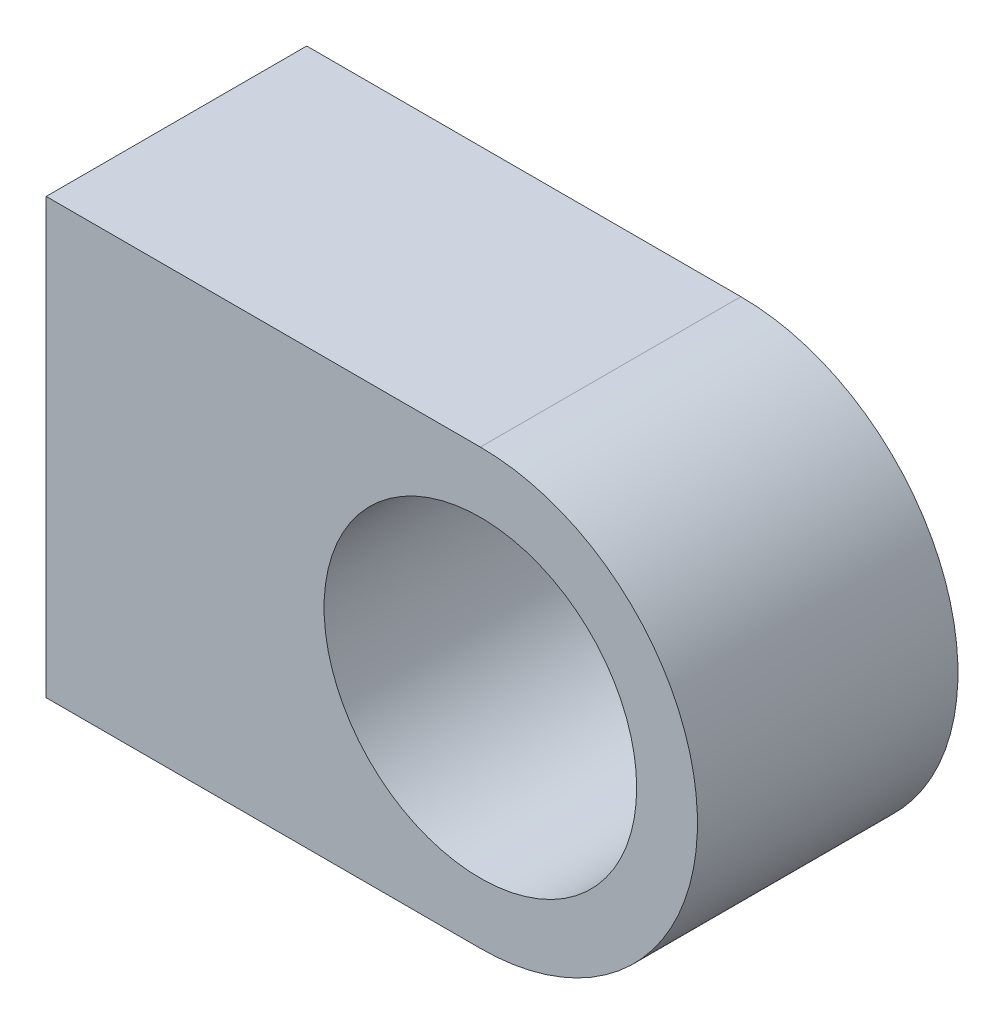
ISO-10303-21;
HEADER;
FILE_DESCRIPTION(('STEP AP214'),'2;1');
FILE_NAME('part.step','',(''),(''),'','','');
FILE_SCHEMA(('AUTOMOTIVE_DESIGN { 1 0 10303 214 1 1 1 1 }'));
ENDSEC;
DATA;
#1=APPLICATION_CONTEXT('core data for automotive mechanical design processes');
#2=APPLICATION_PROTOCOL_DEFINITION('international standard','automotive_design',2000,#1);
#3=PRODUCT_CONTEXT('',#1,'mechanical');
#4=PRODUCT('Part','Part','',(#3));
#5=PRODUCT_RELATED_PRODUCT_CATEGORY('part','',(#4));
#6=PRODUCT_DEFINITION_FORMATION('','',#4);
#7=PRODUCT_DEFINITION_CONTEXT('part definition',#1,'design');
#8=PRODUCT_DEFINITION('design','',#6,#7);
#9=PRODUCT_DEFINITION_SHAPE('','',#8);
#10=(LENGTH_UNIT() NAMED_UNIT(*) SI_UNIT(.MILLI.,.METRE.));
#11=(NAMED_UNIT(*) PLANE_ANGLE_UNIT() SI_UNIT($,.RADIAN.));
#12=(NAMED_UNIT(*) SI_UNIT($,.STERADIAN.) SOLID_ANGLE_UNIT());
#13=UNCERTAINTY_MEASURE_WITH_UNIT(LENGTH_MEASURE(1.E-05),#10,'distance_accuracy_value','');
#14=(GEOMETRIC_REPRESENTATION_CONTEXT(3) GLOBAL_UNCERTAINTY_ASSIGNED_CONTEXT((#13)) GLOBAL_UNIT_ASSIGNED_CONTEXT((#10,
#11,#12)) REPRESENTATION_CONTEXT('',''));
#15=CARTESIAN_POINT('',(0.,0.,0.));
#16=DIRECTION('',(0.,0.,1.));
#17=DIRECTION('',(1.,0.,0.));
#18=AXIS2_PLACEMENT_3D('',#15,#16,#17);
#19=CARTESIAN_POINT('',(0.,-2.5,3.));
#20=DIRECTION('',(0.,0.,-1.));
#21=DIRECTION('',(-1.,0.,0.));
#22=AXIS2_PLACEMENT_3D('',#19,#20,#21);
#23=PLANE('',#22);
#24=CARTESIAN_POINT('',(0.,-2.5,3.));
#25=DIRECTION('',(0.,0.,1.));
#26=DIRECTION('',(-1.,0.,0.));
#27=AXIS2_PLACEMENT_3D('',#24,#25,#26);
#28=CIRCLE('',#27,2.5);
#29=CARTESIAN_POINT('',(0.,-5.,3.));
#30=VERTEX_POINT('',#29);
#31=CARTESIAN_POINT('',(0.,0.,3.));
#32=VERTEX_POINT('',#31);
#33=EDGE_CURVE('E90',#30,#32,#28,.T.);
#34=ORIENTED_EDGE('',*,*,#33,.T.);
#35=DIRECTION('',(-1.,0.,0.));
#36=VECTOR('',#35,1.);
#37=CARTESIAN_POINT('',(0.,0.,3.));
#38=LINE('',#37,#36);
#39=CARTESIAN_POINT('',(-5.,0.,3.));
#40=VERTEX_POINT('',#39);
#41=EDGE_CURVE('E85',#32,#40,#38,.T.);
#42=ORIENTED_EDGE('',*,*,#41,.T.);
#43=DIRECTION('',(0.,-1.,0.));
#44=VECTOR('',#43,1.);
#45=CARTESIAN_POINT('',(-5.,0.,3.));
#46=LINE('',#45,#44);
#47=CARTESIAN_POINT('',(-5.,-5.,3.));
#48=VERTEX_POINT('',#47);
#49=EDGE_CURVE('E88',#40,#48,#46,.T.);
#50=ORIENTED_EDGE('',*,*,#49,.T.);
#51=DIRECTION('',(1.,0.,0.));
#52=VECTOR('',#51,1.);
#53=CARTESIAN_POINT('',(-5.,-5.,3.));
#54=LINE('',#53,#52);
#55=EDGE_CURVE('E55',#48,#30,#54,.T.);
#56=ORIENTED_EDGE('',*,*,#55,.T.);
#57=EDGE_LOOP('',(#34,#42,#50,#56));
#58=FACE_BOUND('',#57,.T.);
#59=CARTESIAN_POINT('',(0.,-2.5,3.));
#60=DIRECTION('',(0.,0.,1.));
#61=DIRECTION('',(1.,0.,0.));
#62=AXIS2_PLACEMENT_3D('',#59,#60,#61);
#63=CIRCLE('',#62,1.8);
#64=CARTESIAN_POINT('',(1.8,-2.5,3.));
#65=VERTEX_POINT('',#64);
#66=EDGE_CURVE('E105',#65,#65,#63,.T.);
#67=ORIENTED_EDGE('',*,*,#66,.F.);
#68=EDGE_LOOP('',(#67));
#69=FACE_BOUND('',#68,.T.);
#70=ADVANCED_FACE('F38',(#58,#69),#23,.F.);
#71=CARTESIAN_POINT('',(0.,-2.5,0.));
#72=DIRECTION('',(0.,0.,-1.));
#73=DIRECTION('',(-1.,0.,0.));
#74=AXIS2_PLACEMENT_3D('',#71,#72,#73);
#75=PLANE('',#74);
#76=CARTESIAN_POINT('',(0.,-2.5,0.));
#77=DIRECTION('',(0.,0.,1.));
#78=DIRECTION('',(-1.,0.,0.));
#79=AXIS2_PLACEMENT_3D('',#76,#77,#78);
#80=CIRCLE('',#79,2.5);
#81=CARTESIAN_POINT('',(0.,-5.,0.));
#82=VERTEX_POINT('',#81);
#83=CARTESIAN_POINT('',(0.,0.,0.));
#84=VERTEX_POINT('',#83);
#85=EDGE_CURVE('E102',#82,#84,#80,.T.);
#86=ORIENTED_EDGE('',*,*,#85,.F.);
#87=DIRECTION('',(1.,0.,0.));
#88=VECTOR('',#87,1.);
#89=CARTESIAN_POINT('',(-5.,-5.,0.));
#90=LINE('',#89,#88);
#91=CARTESIAN_POINT('',(-5.,-5.,0.));
#92=VERTEX_POINT('',#91);
#93=EDGE_CURVE('E78',#92,#82,#90,.T.);
#94=ORIENTED_EDGE('',*,*,#93,.F.);
#95=DIRECTION('',(0.,-1.,0.));
#96=VECTOR('',#95,1.);
#97=CARTESIAN_POINT('',(-5.,0.,0.));
#98=LINE('',#97,#96);
#99=CARTESIAN_POINT('',(-5.,0.,0.));
#100=VERTEX_POINT('',#99);
#101=EDGE_CURVE('E72',#100,#92,#98,.T.);
#102=ORIENTED_EDGE('',*,*,#101,.F.);
#103=DIRECTION('',(-1.,0.,0.));
#104=VECTOR('',#103,1.);
#105=CARTESIAN_POINT('',(0.,0.,0.));
#106=LINE('',#105,#104);
#107=EDGE_CURVE('E94',#84,#100,#106,.T.);
#108=ORIENTED_EDGE('',*,*,#107,.F.);
#109=EDGE_LOOP('',(#86,#94,#102,#108));
#110=FACE_BOUND('',#109,.T.);
#111=CARTESIAN_POINT('',(0.,-2.5,0.));
#112=DIRECTION('',(0.,0.,1.));
#113=DIRECTION('',(1.,0.,0.));
#114=AXIS2_PLACEMENT_3D('',#111,#112,#113);
#115=CIRCLE('',#114,1.8);
#116=CARTESIAN_POINT('',(1.8,-2.5,0.));
#117=VERTEX_POINT('',#116);
#118=EDGE_CURVE('E117',#117,#117,#115,.T.);
#119=ORIENTED_EDGE('',*,*,#118,.T.);
#120=EDGE_LOOP('',(#119));
#121=FACE_BOUND('',#120,.T.);
#122=ADVANCED_FACE('F113',(#110,#121),#75,.T.);
#123=CARTESIAN_POINT('',(0.,-2.5,3.));
#124=DIRECTION('',(0.,0.,-1.));
#125=DIRECTION('',(-1.,0.,0.));
#126=AXIS2_PLACEMENT_3D('',#123,#124,#125);
#127=CYLINDRICAL_SURFACE('',#126,2.5);
#128=ORIENTED_EDGE('',*,*,#85,.T.);
#129=DIRECTION('',(0.,0.,-1.));
#130=VECTOR('',#129,1.);
#131=CARTESIAN_POINT('',(0.,0.,3.));
#132=LINE('',#131,#130);
#133=EDGE_CURVE('E11',#32,#84,#132,.T.);
#134=ORIENTED_EDGE('',*,*,#133,.F.);
#135=ORIENTED_EDGE('',*,*,#33,.F.);
#136=DIRECTION('',(0.,0.,-1.));
#137=VECTOR('',#136,1.);
#138=CARTESIAN_POINT('',(0.,-5.,3.));
#139=LINE('',#138,#137);
#140=EDGE_CURVE('E98',#30,#82,#139,.T.);
#141=ORIENTED_EDGE('',*,*,#140,.T.);
#142=EDGE_LOOP('',(#128,#134,#135,#141));
#143=FACE_BOUND('',#142,.T.);
#144=ADVANCED_FACE('F40',(#143),#127,.T.);
#145=CARTESIAN_POINT('',(0.,0.,3.));
#146=DIRECTION('',(0.,-1.,0.));
#147=DIRECTION('',(0.,0.,-1.));
#148=AXIS2_PLACEMENT_3D('',#145,#146,#147);
#149=PLANE('',#148);
#150=ORIENTED_EDGE('',*,*,#107,.T.);
#151=DIRECTION('',(0.,0.,-1.));
#152=VECTOR('',#151,1.);
#153=CARTESIAN_POINT('',(-5.,0.,3.));
#154=LINE('',#153,#152);
#155=EDGE_CURVE('E47',#40,#100,#154,.T.);
#156=ORIENTED_EDGE('',*,*,#155,.F.);
#157=ORIENTED_EDGE('',*,*,#41,.F.);
#158=ORIENTED_EDGE('',*,*,#133,.T.);
#159=EDGE_LOOP('',(#150,#156,#157,#158));
#160=FACE_BOUND('',#159,.T.);
#161=ADVANCED_FACE('F93',(#160),#149,.F.);
#162=CARTESIAN_POINT('',(-5.,0.,3.));
#163=DIRECTION('',(1.,0.,0.));
#164=DIRECTION('',(0.,1.,0.));
#165=AXIS2_PLACEMENT_3D('',#162,#163,#164);
#166=PLANE('',#165);
#167=ORIENTED_EDGE('',*,*,#101,.T.);
#168=DIRECTION('',(0.,0.,-1.));
#169=VECTOR('',#168,1.);
#170=CARTESIAN_POINT('',(-5.,-5.,3.));
#171=LINE('',#170,#169);
#172=EDGE_CURVE('E95',#48,#92,#171,.T.);
#173=ORIENTED_EDGE('',*,*,#172,.F.);
#174=ORIENTED_EDGE('',*,*,#49,.F.);
#175=ORIENTED_EDGE('',*,*,#155,.T.);
#176=EDGE_LOOP('',(#167,#173,#174,#175));
#177=FACE_BOUND('',#176,.T.);
#178=ADVANCED_FACE('F96',(#177),#166,.F.);
#179=CARTESIAN_POINT('',(-5.,-5.,3.));
#180=DIRECTION('',(0.,1.,0.));
#181=DIRECTION('',(0.,0.,1.));
#182=AXIS2_PLACEMENT_3D('',#179,#180,#181);
#183=PLANE('',#182);
#184=ORIENTED_EDGE('',*,*,#93,.T.);
#185=ORIENTED_EDGE('',*,*,#140,.F.);
#186=ORIENTED_EDGE('',*,*,#55,.F.);
#187=ORIENTED_EDGE('',*,*,#172,.T.);
#188=EDGE_LOOP('',(#184,#185,#186,#187));
#189=FACE_BOUND('',#188,.T.);
#190=ADVANCED_FACE('F110',(#189),#183,.F.);
#191=CARTESIAN_POINT('',(0.,-2.5,3.));
#192=DIRECTION('',(0.,0.,-1.));
#193=DIRECTION('',(-1.,0.,0.));
#194=AXIS2_PLACEMENT_3D('',#191,#192,#193);
#195=CYLINDRICAL_SURFACE('',#194,1.8);
#196=ORIENTED_EDGE('',*,*,#66,.T.);
#197=EDGE_LOOP('',(#196));
#198=FACE_BOUND('',#197,.T.);
#199=ORIENTED_EDGE('',*,*,#118,.F.);
#200=EDGE_LOOP('',(#199));
#201=FACE_BOUND('',#200,.T.);
#202=ADVANCED_FACE('F123',(#198,#201),#195,.F.);
#203=CLOSED_SHELL('',(#70,#122,#144,#161,#178,#190,#202));
#204=MANIFOLD_SOLID_BREP('B2',#203);
#205=ADVANCED_BREP_SHAPE_REPRESENTATION('',(#18,#204),#14);
#206=SHAPE_DEFINITION_REPRESENTATION(#9,#205);
ENDSEC;
END-ISO-10303-21;
